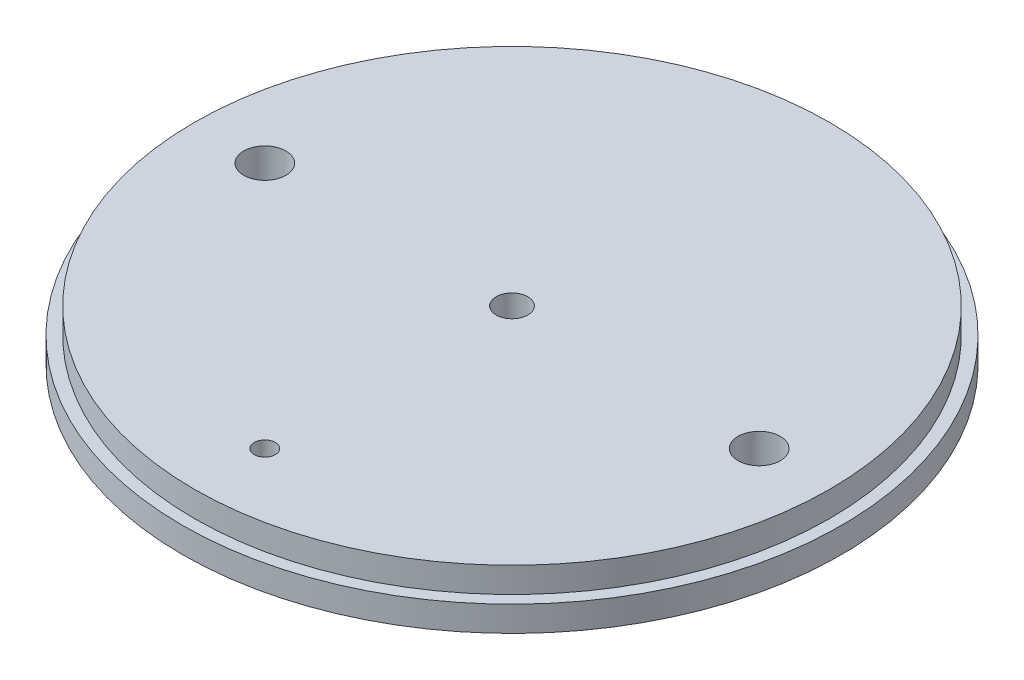
ISO-10303-21;
HEADER;
FILE_DESCRIPTION(('STEP AP214'),'2;1');
FILE_NAME('part.step','',(''),(''),'','','');
FILE_SCHEMA(('AUTOMOTIVE_DESIGN { 1 0 10303 214 1 1 1 1 }'));
ENDSEC;
DATA;
#1=APPLICATION_CONTEXT('core data for automotive mechanical design processes');
#2=APPLICATION_PROTOCOL_DEFINITION('international standard','automotive_design',2000,#1);
#3=PRODUCT_CONTEXT('',#1,'mechanical');
#4=PRODUCT('Part','Part','',(#3));
#5=PRODUCT_RELATED_PRODUCT_CATEGORY('part','',(#4));
#6=PRODUCT_DEFINITION_FORMATION('','',#4);
#7=PRODUCT_DEFINITION_CONTEXT('part definition',#1,'design');
#8=PRODUCT_DEFINITION('design','',#6,#7);
#9=PRODUCT_DEFINITION_SHAPE('','',#8);
#10=(LENGTH_UNIT() NAMED_UNIT(*) SI_UNIT(.MILLI.,.METRE.));
#11=(NAMED_UNIT(*) PLANE_ANGLE_UNIT() SI_UNIT($,.RADIAN.));
#12=(NAMED_UNIT(*) SI_UNIT($,.STERADIAN.) SOLID_ANGLE_UNIT());
#13=UNCERTAINTY_MEASURE_WITH_UNIT(LENGTH_MEASURE(1.E-05),#10,'distance_accuracy_value','');
#14=(GEOMETRIC_REPRESENTATION_CONTEXT(3) GLOBAL_UNCERTAINTY_ASSIGNED_CONTEXT((#13)) GLOBAL_UNIT_ASSIGNED_CONTEXT((#10,
#11,#12)) REPRESENTATION_CONTEXT('',''));
#15=CARTESIAN_POINT('',(0.,0.,0.));
#16=DIRECTION('',(0.,0.,1.));
#17=DIRECTION('',(1.,0.,0.));
#18=AXIS2_PLACEMENT_3D('',#15,#16,#17);
#19=CARTESIAN_POINT('',(0.,3.81,0.));
#20=DIRECTION('',(0.,-1.,0.));
#21=DIRECTION('',(0.,0.,-1.));
#22=AXIS2_PLACEMENT_3D('',#19,#20,#21);
#23=CYLINDRICAL_SURFACE('',#22,49.53);
#24=CARTESIAN_POINT('',(0.,3.81,0.));
#25=DIRECTION('',(0.,1.,0.));
#26=DIRECTION('',(0.,0.,1.));
#27=AXIS2_PLACEMENT_3D('',#24,#25,#26);
#28=CIRCLE('',#27,49.53);
#29=CARTESIAN_POINT('',(0.,3.81,-49.53));
#30=VERTEX_POINT('',#29);
#31=EDGE_CURVE('E50',#30,#30,#28,.T.);
#32=CARTESIAN_POINT('',(0.,0.,0.));
#33=DIRECTION('',(0.,1.,0.));
#34=DIRECTION('',(0.,0.,1.));
#35=AXIS2_PLACEMENT_3D('',#32,#33,#34);
#36=CIRCLE('',#35,49.53);
#37=CARTESIAN_POINT('',(0.,0.,-49.53));
#38=VERTEX_POINT('',#37);
#39=EDGE_CURVE('E56',#38,#38,#36,.T.);
#40=CARTESIAN_POINT('',(0.,3.81,-49.53));
#41=CARTESIAN_POINT('',(0.,3.7703125,-49.53));
#42=CARTESIAN_POINT('',(0.,3.730625,-49.53));
#43=CARTESIAN_POINT('',(0.,3.65125,-49.53));
#44=CARTESIAN_POINT('',(0.,3.6115625,-49.53));
#45=CARTESIAN_POINT('',(0.,3.5321875,-49.53));
#46=CARTESIAN_POINT('',(0.,3.4925,-49.53));
#47=CARTESIAN_POINT('',(0.,3.413125,-49.53));
#48=CARTESIAN_POINT('',(0.,3.3734375,-49.53));
#49=CARTESIAN_POINT('',(0.,3.2940625,-49.53));
#50=CARTESIAN_POINT('',(0.,3.254375,-49.53));
#51=CARTESIAN_POINT('',(0.,3.175,-49.53));
#52=CARTESIAN_POINT('',(0.,3.1353125,-49.53));
#53=CARTESIAN_POINT('',(0.,3.0559375,-49.53));
#54=CARTESIAN_POINT('',(0.,3.01625,-49.53));
#55=CARTESIAN_POINT('',(0.,2.936875,-49.53));
#56=CARTESIAN_POINT('',(0.,2.8971875,-49.53));
#57=CARTESIAN_POINT('',(0.,2.8178125,-49.53));
#58=CARTESIAN_POINT('',(0.,2.778125,-49.53));
#59=CARTESIAN_POINT('',(0.,2.69875,-49.53));
#60=CARTESIAN_POINT('',(0.,2.6590625,-49.53));
#61=CARTESIAN_POINT('',(0.,2.5796875,-49.53));
#62=CARTESIAN_POINT('',(0.,2.54,-49.53));
#63=CARTESIAN_POINT('',(0.,2.460625,-49.53));
#64=CARTESIAN_POINT('',(0.,2.4209375,-49.53));
#65=CARTESIAN_POINT('',(0.,2.3415625,-49.53));
#66=CARTESIAN_POINT('',(0.,2.301875,-49.53));
#67=CARTESIAN_POINT('',(0.,2.2225,-49.53));
#68=CARTESIAN_POINT('',(0.,2.1828125,-49.53));
#69=CARTESIAN_POINT('',(0.,2.1034375,-49.53));
#70=CARTESIAN_POINT('',(0.,2.06375,-49.53));
#71=CARTESIAN_POINT('',(0.,1.984375,-49.53));
#72=CARTESIAN_POINT('',(0.,1.9446875,-49.53));
#73=CARTESIAN_POINT('',(0.,1.8653125,-49.53));
#74=CARTESIAN_POINT('',(0.,1.825625,-49.53));
#75=CARTESIAN_POINT('',(0.,1.74625,-49.53));
#76=CARTESIAN_POINT('',(0.,1.7065625,-49.53));
#77=CARTESIAN_POINT('',(0.,1.6271875,-49.53));
#78=CARTESIAN_POINT('',(0.,1.5875,-49.53));
#79=CARTESIAN_POINT('',(0.,1.508125,-49.53));
#80=CARTESIAN_POINT('',(0.,1.4684375,-49.53));
#81=CARTESIAN_POINT('',(0.,1.3890625,-49.53));
#82=CARTESIAN_POINT('',(0.,1.349375,-49.53));
#83=CARTESIAN_POINT('',(0.,1.27,-49.53));
#84=CARTESIAN_POINT('',(0.,1.2303125,-49.53));
#85=CARTESIAN_POINT('',(0.,1.1509375,-49.53));
#86=CARTESIAN_POINT('',(0.,1.11125,-49.53));
#87=CARTESIAN_POINT('',(0.,1.031875,-49.53));
#88=CARTESIAN_POINT('',(0.,0.9921875,-49.53));
#89=CARTESIAN_POINT('',(0.,0.9128125,-49.53));
#90=CARTESIAN_POINT('',(0.,0.873125,-49.53));
#91=CARTESIAN_POINT('',(0.,0.79375,-49.53));
#92=CARTESIAN_POINT('',(0.,0.7540625,-49.53));
#93=CARTESIAN_POINT('',(0.,0.6746875,-49.53));
#94=CARTESIAN_POINT('',(0.,0.635,-49.53));
#95=CARTESIAN_POINT('',(0.,0.555625,-49.53));
#96=CARTESIAN_POINT('',(0.,0.5159375,-49.53));
#97=CARTESIAN_POINT('',(0.,0.4365625,-49.53));
#98=CARTESIAN_POINT('',(0.,0.396875,-49.53));
#99=CARTESIAN_POINT('',(0.,0.3175,-49.53));
#100=CARTESIAN_POINT('',(0.,0.2778125,-49.53));
#101=CARTESIAN_POINT('',(0.,0.1984375,-49.53));
#102=CARTESIAN_POINT('',(0.,0.15875,-49.53));
#103=CARTESIAN_POINT('',(0.,0.0793749999999999,-49.53));
#104=CARTESIAN_POINT('',(0.,0.0396874999999999,-49.53));
#105=CARTESIAN_POINT('',(0.,0.,-49.53));
#106=B_SPLINE_CURVE_WITH_KNOTS('',3,(#40,#41,#42,#43,#44,#45,#46,#47,#48,#49,#50,#51,#52,#53,
#54,#55,#56,#57,#58,#59,#60,#61,#62,#63,#64,#65,#66,#67,#68,#69,#70,#71,#72,#73,#74,#75,#76,#77,
#78,#79,#80,#81,#82,#83,#84,#85,#86,#87,#88,#89,#90,#91,#92,#93,#94,#95,#96,#97,#98,#99,#100,
#101,#102,#103,#104,#105),.UNSPECIFIED.,.F.,.F.,(4,2,2,2,2,2,2,2,2,2,2,2,2,2,2,2,2,2,2,2,2,2,2,
2,2,2,2,2,2,2,2,2,4),(0.,0.1190625,0.238125,0.3571875,0.47625,0.5953125,0.714375,0.8334375,
0.9525,1.0715625,1.190625,1.3096875,1.42875,1.5478125,1.666875,1.7859375,1.905,2.0240625,
2.143125,2.2621875,2.38125,2.5003125,2.619375,2.7384375,2.8575,2.9765625,3.095625,3.2146875,
3.33375,3.4528125,3.571875,3.6909375,3.81),.UNSPECIFIED.);
#107=EDGE_CURVE('BSEAM42',#30,#38,#106,.T.);
#108=ORIENTED_EDGE('',*,*,#31,.F.);
#109=ORIENTED_EDGE('',*,*,#39,.T.);
#110=ORIENTED_EDGE('',*,*,#107,.T.);
#111=ORIENTED_EDGE('',*,*,#107,.F.);
#112=EDGE_LOOP('',(#108,#110,#109,#111));
#113=FACE_BOUND('',#112,.T.);
#114=ADVANCED_FACE('F42',(#113),#23,.T.);
#115=CARTESIAN_POINT('',(0.,3.81,0.));
#116=DIRECTION('',(0.,1.,0.));
#117=DIRECTION('',(0.,0.,1.));
#118=AXIS2_PLACEMENT_3D('',#115,#116,#117);
#119=PLANE('',#118);
#120=CARTESIAN_POINT('',(0.,3.81,0.));
#121=DIRECTION('',(0.,1.,0.));
#122=DIRECTION('',(0.,0.,1.));
#123=AXIS2_PLACEMENT_3D('',#120,#121,#122);
#124=CIRCLE('',#123,47.752);
#125=CARTESIAN_POINT('',(0.,3.81,-47.752));
#126=VERTEX_POINT('',#125);
#127=EDGE_CURVE('E10',#126,#126,#124,.T.);
#128=ORIENTED_EDGE('',*,*,#127,.F.);
#129=EDGE_LOOP('',(#128));
#130=FACE_BOUND('',#129,.T.);
#131=ORIENTED_EDGE('',*,*,#31,.T.);
#132=EDGE_LOOP('',(#131));
#133=FACE_BOUND('',#132,.T.);
#134=ADVANCED_FACE('F100',(#130,#133),#119,.T.);
#135=CARTESIAN_POINT('',(0.,0.,0.));
#136=DIRECTION('',(0.,1.,0.));
#137=DIRECTION('',(0.,0.,1.));
#138=AXIS2_PLACEMENT_3D('',#135,#136,#137);
#139=PLANE('',#138);
#140=CARTESIAN_POINT('',(37.1475,0.,0.));
#141=DIRECTION('',(0.,-1.,0.));
#142=DIRECTION('',(0.,0.,-1.));
#143=AXIS2_PLACEMENT_3D('',#140,#141,#142);
#144=CIRCLE('',#143,3.175);
#145=CARTESIAN_POINT('',(37.1475,0.,-3.175));
#146=VERTEX_POINT('',#145);
#147=EDGE_CURVE('E70',#146,#146,#144,.T.);
#148=ORIENTED_EDGE('',*,*,#147,.F.);
#149=EDGE_LOOP('',(#148));
#150=FACE_BOUND('',#149,.T.);
#151=CARTESIAN_POINT('',(0.,0.,0.));
#152=DIRECTION('',(0.,-1.,0.));
#153=DIRECTION('',(0.,0.,-1.));
#154=AXIS2_PLACEMENT_3D('',#151,#152,#153);
#155=CIRCLE('',#154,2.38125);
#156=CARTESIAN_POINT('',(0.,0.,-2.38125));
#157=VERTEX_POINT('',#156);
#158=EDGE_CURVE('E186',#157,#157,#155,.T.);
#159=ORIENTED_EDGE('',*,*,#158,.F.);
#160=EDGE_LOOP('',(#159));
#161=FACE_BOUND('',#160,.T.);
#162=CARTESIAN_POINT('',(0.,0.,37.1475));
#163=DIRECTION('',(0.,-1.,0.));
#164=DIRECTION('',(0.,0.,-1.));
#165=AXIS2_PLACEMENT_3D('',#162,#163,#164);
#166=CIRCLE('',#165,1.5875);
#167=CARTESIAN_POINT('',(0.,0.,35.56));
#168=VERTEX_POINT('',#167);
#169=EDGE_CURVE('E183',#168,#168,#166,.T.);
#170=ORIENTED_EDGE('',*,*,#169,.F.);
#171=EDGE_LOOP('',(#170));
#172=FACE_BOUND('',#171,.T.);
#173=CARTESIAN_POINT('',(-37.1475,0.,0.));
#174=DIRECTION('',(0.,-1.,0.));
#175=DIRECTION('',(0.,0.,-1.));
#176=AXIS2_PLACEMENT_3D('',#173,#174,#175);
#177=CIRCLE('',#176,3.175);
#178=CARTESIAN_POINT('',(-37.1475,0.,-3.175));
#179=VERTEX_POINT('',#178);
#180=EDGE_CURVE('E179',#179,#179,#177,.T.);
#181=ORIENTED_EDGE('',*,*,#180,.F.);
#182=EDGE_LOOP('',(#181));
#183=FACE_BOUND('',#182,.T.);
#184=ORIENTED_EDGE('',*,*,#39,.F.);
#185=EDGE_LOOP('',(#184));
#186=FACE_BOUND('',#185,.T.);
#187=ADVANCED_FACE('F90',(#150,#161,#172,#183,#186),#139,.F.);
#188=CARTESIAN_POINT('',(0.,7.62,0.));
#189=DIRECTION('',(0.,-1.,0.));
#190=DIRECTION('',(0.,0.,-1.));
#191=AXIS2_PLACEMENT_3D('',#188,#189,#190);
#192=CYLINDRICAL_SURFACE('',#191,47.752);
#193=CARTESIAN_POINT('',(0.,7.62,0.));
#194=DIRECTION('',(0.,1.,0.));
#195=DIRECTION('',(0.,0.,1.));
#196=AXIS2_PLACEMENT_3D('',#193,#194,#195);
#197=CIRCLE('',#196,47.752);
#198=CARTESIAN_POINT('',(0.,7.62,-47.752));
#199=VERTEX_POINT('',#198);
#200=EDGE_CURVE('E59',#199,#199,#197,.T.);
#201=CARTESIAN_POINT('',(0.,7.62,-47.752));
#202=CARTESIAN_POINT('',(0.,7.5803125,-47.752));
#203=CARTESIAN_POINT('',(0.,7.540625,-47.752));
#204=CARTESIAN_POINT('',(0.,7.46125,-47.752));
#205=CARTESIAN_POINT('',(0.,7.4215625,-47.752));
#206=CARTESIAN_POINT('',(0.,7.3421875,-47.752));
#207=CARTESIAN_POINT('',(0.,7.3025,-47.752));
#208=CARTESIAN_POINT('',(0.,7.223125,-47.752));
#209=CARTESIAN_POINT('',(0.,7.1834375,-47.752));
#210=CARTESIAN_POINT('',(0.,7.1040625,-47.752));
#211=CARTESIAN_POINT('',(0.,7.064375,-47.752));
#212=CARTESIAN_POINT('',(0.,6.985,-47.752));
#213=CARTESIAN_POINT('',(0.,6.9453125,-47.752));
#214=CARTESIAN_POINT('',(0.,6.8659375,-47.752));
#215=CARTESIAN_POINT('',(0.,6.82625,-47.752));
#216=CARTESIAN_POINT('',(0.,6.746875,-47.752));
#217=CARTESIAN_POINT('',(0.,6.7071875,-47.752));
#218=CARTESIAN_POINT('',(0.,6.6278125,-47.752));
#219=CARTESIAN_POINT('',(0.,6.588125,-47.752));
#220=CARTESIAN_POINT('',(0.,6.50875,-47.752));
#221=CARTESIAN_POINT('',(0.,6.4690625,-47.752));
#222=CARTESIAN_POINT('',(0.,6.3896875,-47.752));
#223=CARTESIAN_POINT('',(0.,6.35,-47.752));
#224=CARTESIAN_POINT('',(0.,6.270625,-47.752));
#225=CARTESIAN_POINT('',(0.,6.2309375,-47.752));
#226=CARTESIAN_POINT('',(0.,6.1515625,-47.752));
#227=CARTESIAN_POINT('',(0.,6.111875,-47.752));
#228=CARTESIAN_POINT('',(0.,6.0325,-47.752));
#229=CARTESIAN_POINT('',(0.,5.9928125,-47.752));
#230=CARTESIAN_POINT('',(0.,5.9134375,-47.752));
#231=CARTESIAN_POINT('',(0.,5.87375,-47.752));
#232=CARTESIAN_POINT('',(0.,5.794375,-47.752));
#233=CARTESIAN_POINT('',(0.,5.7546875,-47.752));
#234=CARTESIAN_POINT('',(0.,5.6753125,-47.752));
#235=CARTESIAN_POINT('',(0.,5.635625,-47.752));
#236=CARTESIAN_POINT('',(0.,5.55625,-47.752));
#237=CARTESIAN_POINT('',(0.,5.5165625,-47.752));
#238=CARTESIAN_POINT('',(0.,5.4371875,-47.752));
#239=CARTESIAN_POINT('',(0.,5.3975,-47.752));
#240=CARTESIAN_POINT('',(0.,5.318125,-47.752));
#241=CARTESIAN_POINT('',(0.,5.2784375,-47.752));
#242=CARTESIAN_POINT('',(0.,5.1990625,-47.752));
#243=CARTESIAN_POINT('',(0.,5.159375,-47.752));
#244=CARTESIAN_POINT('',(0.,5.08,-47.752));
#245=CARTESIAN_POINT('',(0.,5.0403125,-47.752));
#246=CARTESIAN_POINT('',(0.,4.9609375,-47.752));
#247=CARTESIAN_POINT('',(0.,4.92125,-47.752));
#248=CARTESIAN_POINT('',(0.,4.841875,-47.752));
#249=CARTESIAN_POINT('',(0.,4.8021875,-47.752));
#250=CARTESIAN_POINT('',(0.,4.7228125,-47.752));
#251=CARTESIAN_POINT('',(0.,4.683125,-47.752));
#252=CARTESIAN_POINT('',(0.,4.60375,-47.752));
#253=CARTESIAN_POINT('',(0.,4.5640625,-47.752));
#254=CARTESIAN_POINT('',(0.,4.4846875,-47.752));
#255=CARTESIAN_POINT('',(0.,4.445,-47.752));
#256=CARTESIAN_POINT('',(0.,4.365625,-47.752));
#257=CARTESIAN_POINT('',(0.,4.3259375,-47.752));
#258=CARTESIAN_POINT('',(0.,4.2465625,-47.752));
#259=CARTESIAN_POINT('',(0.,4.206875,-47.752));
#260=CARTESIAN_POINT('',(0.,4.1275,-47.752));
#261=CARTESIAN_POINT('',(0.,4.0878125,-47.752));
#262=CARTESIAN_POINT('',(0.,4.0084375,-47.752));
#263=CARTESIAN_POINT('',(0.,3.96875,-47.752));
#264=CARTESIAN_POINT('',(0.,3.889375,-47.752));
#265=CARTESIAN_POINT('',(0.,3.8496875,-47.752));
#266=CARTESIAN_POINT('',(0.,3.81,-47.752));
#267=B_SPLINE_CURVE_WITH_KNOTS('',3,(#201,#202,#203,#204,#205,#206,#207,#208,#209,#210,#211,
#212,#213,#214,#215,#216,#217,#218,#219,#220,#221,#222,#223,#224,#225,#226,#227,#228,#229,#230,
#231,#232,#233,#234,#235,#236,#237,#238,#239,#240,#241,#242,#243,#244,#245,#246,#247,#248,#249,
#250,#251,#252,#253,#254,#255,#256,#257,#258,#259,#260,#261,#262,#263,#264,#265,#266),
.UNSPECIFIED.,.F.,.F.,(4,2,2,2,2,2,2,2,2,2,2,2,2,2,2,2,2,2,2,2,2,2,2,2,2,2,2,2,2,2,2,2,4),(0.,
0.1190625,0.238125,0.357187500000001,0.47625,0.5953125,0.714375000000001,0.8334375,0.9525,
1.0715625,1.190625,1.3096875,1.42875,1.5478125,1.666875,1.7859375,1.905,2.0240625,2.143125,
2.2621875,2.38125,2.5003125,2.619375,2.7384375,2.8575,2.9765625,3.095625,3.2146875,3.33375,
3.4528125,3.571875,3.6909375,3.81),.UNSPECIFIED.);
#268=EDGE_CURVE('BSEAM88',#199,#126,#267,.T.);
#269=ORIENTED_EDGE('',*,*,#200,.F.);
#270=ORIENTED_EDGE('',*,*,#127,.T.);
#271=ORIENTED_EDGE('',*,*,#268,.T.);
#272=ORIENTED_EDGE('',*,*,#268,.F.);
#273=EDGE_LOOP('',(#269,#271,#270,#272));
#274=FACE_BOUND('',#273,.T.);
#275=ADVANCED_FACE('F88',(#274),#192,.T.);
#276=CARTESIAN_POINT('',(0.,7.62,0.));
#277=DIRECTION('',(0.,1.,0.));
#278=DIRECTION('',(0.,0.,1.));
#279=AXIS2_PLACEMENT_3D('',#276,#277,#278);
#280=PLANE('',#279);
#281=CARTESIAN_POINT('',(37.1475,7.62,0.));
#282=DIRECTION('',(0.,1.,0.));
#283=DIRECTION('',(0.,0.,1.));
#284=AXIS2_PLACEMENT_3D('',#281,#282,#283);
#285=CIRCLE('',#284,3.175);
#286=CARTESIAN_POINT('',(37.1475,7.62,3.175));
#287=VERTEX_POINT('',#286);
#288=EDGE_CURVE('E45',#287,#287,#285,.T.);
#289=ORIENTED_EDGE('',*,*,#288,.F.);
#290=EDGE_LOOP('',(#289));
#291=FACE_BOUND('',#290,.T.);
#292=CARTESIAN_POINT('',(0.,7.62,0.));
#293=DIRECTION('',(0.,1.,0.));
#294=DIRECTION('',(0.,0.,1.));
#295=AXIS2_PLACEMENT_3D('',#292,#293,#294);
#296=CIRCLE('',#295,2.38125);
#297=CARTESIAN_POINT('',(0.,7.62,2.38125));
#298=VERTEX_POINT('',#297);
#299=EDGE_CURVE('E73',#298,#298,#296,.T.);
#300=ORIENTED_EDGE('',*,*,#299,.F.);
#301=EDGE_LOOP('',(#300));
#302=FACE_BOUND('',#301,.T.);
#303=CARTESIAN_POINT('',(0.,7.62,37.1475));
#304=DIRECTION('',(0.,1.,0.));
#305=DIRECTION('',(0.,0.,1.));
#306=AXIS2_PLACEMENT_3D('',#303,#304,#305);
#307=CIRCLE('',#306,1.5875);
#308=CARTESIAN_POINT('',(0.,7.62,38.735));
#309=VERTEX_POINT('',#308);
#310=EDGE_CURVE('E69',#309,#309,#307,.T.);
#311=ORIENTED_EDGE('',*,*,#310,.F.);
#312=EDGE_LOOP('',(#311));
#313=FACE_BOUND('',#312,.T.);
#314=CARTESIAN_POINT('',(-37.1475,7.62,0.));
#315=DIRECTION('',(0.,1.,0.));
#316=DIRECTION('',(0.,0.,1.));
#317=AXIS2_PLACEMENT_3D('',#314,#315,#316);
#318=CIRCLE('',#317,3.175);
#319=CARTESIAN_POINT('',(-37.1475,7.62,3.175));
#320=VERTEX_POINT('',#319);
#321=EDGE_CURVE('E65',#320,#320,#318,.T.);
#322=ORIENTED_EDGE('',*,*,#321,.F.);
#323=EDGE_LOOP('',(#322));
#324=FACE_BOUND('',#323,.T.);
#325=ORIENTED_EDGE('',*,*,#200,.T.);
#326=EDGE_LOOP('',(#325));
#327=FACE_BOUND('',#326,.T.);
#328=ADVANCED_FACE('F86',(#291,#302,#313,#324,#327),#280,.T.);
#329=CARTESIAN_POINT('',(-37.1475,17.526,0.));
#330=DIRECTION('',(0.,-1.,0.));
#331=DIRECTION('',(0.,0.,-1.));
#332=AXIS2_PLACEMENT_3D('',#329,#330,#331);
#333=CYLINDRICAL_SURFACE('',#332,3.175);
#334=ORIENTED_EDGE('',*,*,#321,.T.);
#335=EDGE_LOOP('',(#334));
#336=FACE_BOUND('',#335,.T.);
#337=ORIENTED_EDGE('',*,*,#180,.T.);
#338=EDGE_LOOP('',(#337));
#339=FACE_BOUND('',#338,.T.);
#340=ADVANCED_FACE('F97',(#336,#339),#333,.F.);
#341=CARTESIAN_POINT('',(0.,17.526,37.1475));
#342=DIRECTION('',(0.,-1.,0.));
#343=DIRECTION('',(0.,0.,-1.));
#344=AXIS2_PLACEMENT_3D('',#341,#342,#343);
#345=CYLINDRICAL_SURFACE('',#344,1.5875);
#346=ORIENTED_EDGE('',*,*,#310,.T.);
#347=EDGE_LOOP('',(#346));
#348=FACE_BOUND('',#347,.T.);
#349=ORIENTED_EDGE('',*,*,#169,.T.);
#350=EDGE_LOOP('',(#349));
#351=FACE_BOUND('',#350,.T.);
#352=ADVANCED_FACE('F144',(#348,#351),#345,.F.);
#353=CARTESIAN_POINT('',(0.,17.526,0.));
#354=DIRECTION('',(0.,-1.,0.));
#355=DIRECTION('',(0.,0.,-1.));
#356=AXIS2_PLACEMENT_3D('',#353,#354,#355);
#357=CYLINDRICAL_SURFACE('',#356,2.38125);
#358=ORIENTED_EDGE('',*,*,#299,.T.);
#359=EDGE_LOOP('',(#358));
#360=FACE_BOUND('',#359,.T.);
#361=ORIENTED_EDGE('',*,*,#158,.T.);
#362=EDGE_LOOP('',(#361));
#363=FACE_BOUND('',#362,.T.);
#364=ADVANCED_FACE('F154',(#360,#363),#357,.F.);
#365=CARTESIAN_POINT('',(37.1475,17.526,0.));
#366=DIRECTION('',(0.,-1.,0.));
#367=DIRECTION('',(0.,0.,-1.));
#368=AXIS2_PLACEMENT_3D('',#365,#366,#367);
#369=CYLINDRICAL_SURFACE('',#368,3.175);
#370=ORIENTED_EDGE('',*,*,#288,.T.);
#371=EDGE_LOOP('',(#370));
#372=FACE_BOUND('',#371,.T.);
#373=ORIENTED_EDGE('',*,*,#147,.T.);
#374=EDGE_LOOP('',(#373));
#375=FACE_BOUND('',#374,.T.);
#376=ADVANCED_FACE('F164',(#372,#375),#369,.F.);
#377=CLOSED_SHELL('',(#114,#134,#187,#275,#328,#340,#352,#364,#376));
#378=MANIFOLD_SOLID_BREP('B2',#377);
#379=ADVANCED_BREP_SHAPE_REPRESENTATION('',(#18,#378),#14);
#380=SHAPE_DEFINITION_REPRESENTATION(#9,#379);
ENDSEC;
END-ISO-10303-21;
